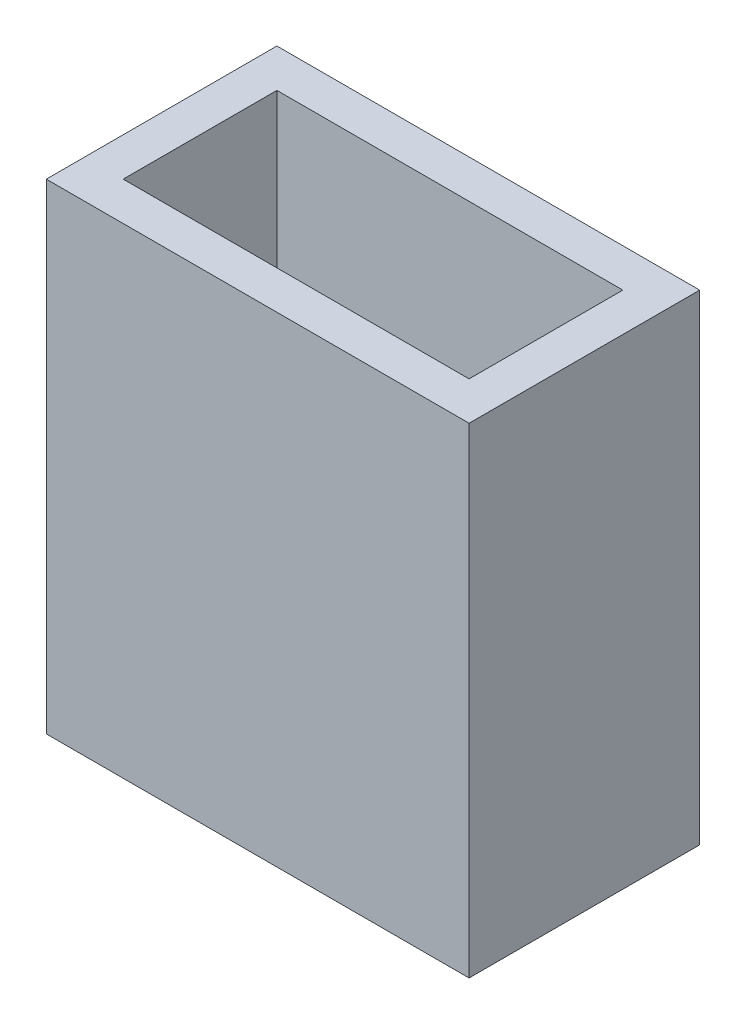
ISO-10303-21;
HEADER;
FILE_DESCRIPTION(('STEP AP214'),'2;1');
FILE_NAME('part.step','',(''),(''),'','','');
FILE_SCHEMA(('AUTOMOTIVE_DESIGN { 1 0 10303 214 1 1 1 1 }'));
ENDSEC;
DATA;
#1=APPLICATION_CONTEXT('core data for automotive mechanical design processes');
#2=APPLICATION_PROTOCOL_DEFINITION('international standard','automotive_design',2000,#1);
#3=PRODUCT_CONTEXT('',#1,'mechanical');
#4=PRODUCT('Part','Part','',(#3));
#5=PRODUCT_RELATED_PRODUCT_CATEGORY('part','',(#4));
#6=PRODUCT_DEFINITION_FORMATION('','',#4);
#7=PRODUCT_DEFINITION_CONTEXT('part definition',#1,'design');
#8=PRODUCT_DEFINITION('design','',#6,#7);
#9=PRODUCT_DEFINITION_SHAPE('','',#8);
#10=(LENGTH_UNIT() NAMED_UNIT(*) SI_UNIT(.MILLI.,.METRE.));
#11=(NAMED_UNIT(*) PLANE_ANGLE_UNIT() SI_UNIT($,.RADIAN.));
#12=(NAMED_UNIT(*) SI_UNIT($,.STERADIAN.) SOLID_ANGLE_UNIT());
#13=UNCERTAINTY_MEASURE_WITH_UNIT(LENGTH_MEASURE(1.E-05),#10,'distance_accuracy_value','');
#14=(GEOMETRIC_REPRESENTATION_CONTEXT(3) GLOBAL_UNCERTAINTY_ASSIGNED_CONTEXT((#13)) GLOBAL_UNIT_ASSIGNED_CONTEXT((#10,
#11,#12)) REPRESENTATION_CONTEXT('',''));
#15=CARTESIAN_POINT('',(0.,0.,0.));
#16=DIRECTION('',(0.,0.,1.));
#17=DIRECTION('',(1.,0.,0.));
#18=AXIS2_PLACEMENT_3D('',#15,#16,#17);
#19=CARTESIAN_POINT('',(0.,0.,12.));
#20=DIRECTION('',(1.,0.,0.));
#21=DIRECTION('',(0.,0.,-1.));
#22=AXIS2_PLACEMENT_3D('',#19,#20,#21);
#23=PLANE('',#22);
#24=DIRECTION('',(0.,-1.,0.));
#25=VECTOR('',#24,1.);
#26=CARTESIAN_POINT('',(0.,0.,0.));
#27=LINE('',#26,#25);
#28=CARTESIAN_POINT('',(0.,25.,0.));
#29=VERTEX_POINT('',#28);
#30=CARTESIAN_POINT('',(0.,0.,0.));
#31=VERTEX_POINT('',#30);
#32=EDGE_CURVE('E130',#29,#31,#27,.T.);
#33=ORIENTED_EDGE('',*,*,#32,.T.);
#34=DIRECTION('',(0.,0.,-1.));
#35=VECTOR('',#34,1.);
#36=CARTESIAN_POINT('',(0.,0.,12.));
#37=LINE('',#36,#35);
#38=CARTESIAN_POINT('',(0.,0.,12.));
#39=VERTEX_POINT('',#38);
#40=EDGE_CURVE('E11',#39,#31,#37,.T.);
#41=ORIENTED_EDGE('',*,*,#40,.F.);
#42=DIRECTION('',(0.,-1.,0.));
#43=VECTOR('',#42,1.);
#44=CARTESIAN_POINT('',(0.,0.,12.));
#45=LINE('',#44,#43);
#46=CARTESIAN_POINT('',(0.,25.,12.));
#47=VERTEX_POINT('',#46);
#48=EDGE_CURVE('E134',#47,#39,#45,.T.);
#49=ORIENTED_EDGE('',*,*,#48,.F.);
#50=DIRECTION('',(0.,0.,-1.));
#51=VECTOR('',#50,1.);
#52=CARTESIAN_POINT('',(0.,25.,12.));
#53=LINE('',#52,#51);
#54=EDGE_CURVE('E144',#47,#29,#53,.T.);
#55=ORIENTED_EDGE('',*,*,#54,.T.);
#56=EDGE_LOOP('',(#33,#41,#49,#55));
#57=FACE_BOUND('',#56,.T.);
#58=ADVANCED_FACE('F33',(#57),#23,.F.);
#59=CARTESIAN_POINT('',(0.,0.,12.));
#60=DIRECTION('',(0.,1.,0.));
#61=DIRECTION('',(0.,0.,1.));
#62=AXIS2_PLACEMENT_3D('',#59,#60,#61);
#63=PLANE('',#62);
#64=DIRECTION('',(-1.,0.,0.));
#65=VECTOR('',#64,1.);
#66=CARTESIAN_POINT('',(2.,0.,2.));
#67=LINE('',#66,#65);
#68=CARTESIAN_POINT('',(20.,0.,2.));
#69=VERTEX_POINT('',#68);
#70=CARTESIAN_POINT('',(2.,0.,2.));
#71=VERTEX_POINT('',#70);
#72=EDGE_CURVE('E105',#69,#71,#67,.T.);
#73=ORIENTED_EDGE('',*,*,#72,.T.);
#74=DIRECTION('',(0.,0.,1.));
#75=VECTOR('',#74,1.);
#76=CARTESIAN_POINT('',(2.,0.,2.));
#77=LINE('',#76,#75);
#78=CARTESIAN_POINT('',(2.,0.,10.));
#79=VERTEX_POINT('',#78);
#80=EDGE_CURVE('E99',#71,#79,#77,.T.);
#81=ORIENTED_EDGE('',*,*,#80,.T.);
#82=DIRECTION('',(1.,0.,0.));
#83=VECTOR('',#82,1.);
#84=CARTESIAN_POINT('',(2.,0.,10.));
#85=LINE('',#84,#83);
#86=CARTESIAN_POINT('',(20.,0.,10.));
#87=VERTEX_POINT('',#86);
#88=EDGE_CURVE('E108',#79,#87,#85,.T.);
#89=ORIENTED_EDGE('',*,*,#88,.T.);
#90=DIRECTION('',(0.,0.,-1.));
#91=VECTOR('',#90,1.);
#92=CARTESIAN_POINT('',(20.,0.,2.));
#93=LINE('',#92,#91);
#94=EDGE_CURVE('E47',#87,#69,#93,.T.);
#95=ORIENTED_EDGE('',*,*,#94,.T.);
#96=EDGE_LOOP('',(#73,#81,#89,#95));
#97=FACE_BOUND('',#96,.T.);
#98=DIRECTION('',(1.,0.,0.));
#99=VECTOR('',#98,1.);
#100=CARTESIAN_POINT('',(0.,0.,0.));
#101=LINE('',#100,#99);
#102=CARTESIAN_POINT('',(22.,0.,0.));
#103=VERTEX_POINT('',#102);
#104=EDGE_CURVE('E147',#31,#103,#101,.T.);
#105=ORIENTED_EDGE('',*,*,#104,.T.);
#106=DIRECTION('',(0.,0.,-1.));
#107=VECTOR('',#106,1.);
#108=CARTESIAN_POINT('',(22.,0.,12.));
#109=LINE('',#108,#107);
#110=CARTESIAN_POINT('',(22.,0.,12.));
#111=VERTEX_POINT('',#110);
#112=EDGE_CURVE('E40',#111,#103,#109,.T.);
#113=ORIENTED_EDGE('',*,*,#112,.F.);
#114=DIRECTION('',(1.,0.,0.));
#115=VECTOR('',#114,1.);
#116=CARTESIAN_POINT('',(0.,0.,12.));
#117=LINE('',#116,#115);
#118=EDGE_CURVE('E137',#39,#111,#117,.T.);
#119=ORIENTED_EDGE('',*,*,#118,.F.);
#120=ORIENTED_EDGE('',*,*,#40,.T.);
#121=EDGE_LOOP('',(#105,#113,#119,#120));
#122=FACE_BOUND('',#121,.T.);
#123=ADVANCED_FACE('F112',(#97,#122),#63,.F.);
#124=CARTESIAN_POINT('',(22.,0.,12.));
#125=DIRECTION('',(-1.,0.,0.));
#126=DIRECTION('',(0.,0.,1.));
#127=AXIS2_PLACEMENT_3D('',#124,#125,#126);
#128=PLANE('',#127);
#129=DIRECTION('',(0.,1.,0.));
#130=VECTOR('',#129,1.);
#131=CARTESIAN_POINT('',(22.,0.,0.));
#132=LINE('',#131,#130);
#133=CARTESIAN_POINT('',(22.,25.,0.));
#134=VERTEX_POINT('',#133);
#135=EDGE_CURVE('E149',#103,#134,#132,.T.);
#136=ORIENTED_EDGE('',*,*,#135,.T.);
#137=DIRECTION('',(0.,0.,-1.));
#138=VECTOR('',#137,1.);
#139=CARTESIAN_POINT('',(22.,25.,12.));
#140=LINE('',#139,#138);
#141=CARTESIAN_POINT('',(22.,25.,12.));
#142=VERTEX_POINT('',#141);
#143=EDGE_CURVE('E154',#142,#134,#140,.T.);
#144=ORIENTED_EDGE('',*,*,#143,.F.);
#145=DIRECTION('',(0.,1.,0.));
#146=VECTOR('',#145,1.);
#147=CARTESIAN_POINT('',(22.,0.,12.));
#148=LINE('',#147,#146);
#149=EDGE_CURVE('E140',#111,#142,#148,.T.);
#150=ORIENTED_EDGE('',*,*,#149,.F.);
#151=ORIENTED_EDGE('',*,*,#112,.T.);
#152=EDGE_LOOP('',(#136,#144,#150,#151));
#153=FACE_BOUND('',#152,.T.);
#154=ADVANCED_FACE('F161',(#153),#128,.F.);
#155=CARTESIAN_POINT('',(0.,25.,12.));
#156=DIRECTION('',(0.,-1.,0.));
#157=DIRECTION('',(0.,0.,-1.));
#158=AXIS2_PLACEMENT_3D('',#155,#156,#157);
#159=PLANE('',#158);
#160=DIRECTION('',(1.,0.,0.));
#161=VECTOR('',#160,1.);
#162=CARTESIAN_POINT('',(2.,25.,10.));
#163=LINE('',#162,#161);
#164=CARTESIAN_POINT('',(2.,25.,10.));
#165=VERTEX_POINT('',#164);
#166=CARTESIAN_POINT('',(20.,25.,10.));
#167=VERTEX_POINT('',#166);
#168=EDGE_CURVE('E124',#165,#167,#163,.T.);
#169=ORIENTED_EDGE('',*,*,#168,.F.);
#170=DIRECTION('',(0.,0.,1.));
#171=VECTOR('',#170,1.);
#172=CARTESIAN_POINT('',(2.,25.,2.));
#173=LINE('',#172,#171);
#174=CARTESIAN_POINT('',(2.,25.,2.));
#175=VERTEX_POINT('',#174);
#176=EDGE_CURVE('E55',#175,#165,#173,.T.);
#177=ORIENTED_EDGE('',*,*,#176,.F.);
#178=DIRECTION('',(-1.,0.,0.));
#179=VECTOR('',#178,1.);
#180=CARTESIAN_POINT('',(2.,25.,2.));
#181=LINE('',#180,#179);
#182=CARTESIAN_POINT('',(20.,25.,2.));
#183=VERTEX_POINT('',#182);
#184=EDGE_CURVE('E115',#183,#175,#181,.T.);
#185=ORIENTED_EDGE('',*,*,#184,.F.);
#186=DIRECTION('',(0.,0.,-1.));
#187=VECTOR('',#186,1.);
#188=CARTESIAN_POINT('',(20.,25.,2.));
#189=LINE('',#188,#187);
#190=EDGE_CURVE('E118',#167,#183,#189,.T.);
#191=ORIENTED_EDGE('',*,*,#190,.F.);
#192=EDGE_LOOP('',(#169,#177,#185,#191));
#193=FACE_BOUND('',#192,.T.);
#194=DIRECTION('',(-1.,0.,0.));
#195=VECTOR('',#194,1.);
#196=CARTESIAN_POINT('',(0.,25.,0.));
#197=LINE('',#196,#195);
#198=EDGE_CURVE('E138',#134,#29,#197,.T.);
#199=ORIENTED_EDGE('',*,*,#198,.T.);
#200=ORIENTED_EDGE('',*,*,#54,.F.);
#201=DIRECTION('',(-1.,0.,0.));
#202=VECTOR('',#201,1.);
#203=CARTESIAN_POINT('',(0.,25.,12.));
#204=LINE('',#203,#202);
#205=EDGE_CURVE('E142',#142,#47,#204,.T.);
#206=ORIENTED_EDGE('',*,*,#205,.F.);
#207=ORIENTED_EDGE('',*,*,#143,.T.);
#208=EDGE_LOOP('',(#199,#200,#206,#207));
#209=FACE_BOUND('',#208,.T.);
#210=ADVANCED_FACE('F169',(#193,#209),#159,.F.);
#211=CARTESIAN_POINT('',(0.,0.,12.));
#212=DIRECTION('',(0.,0.,-1.));
#213=DIRECTION('',(-1.,0.,0.));
#214=AXIS2_PLACEMENT_3D('',#211,#212,#213);
#215=PLANE('',#214);
#216=ORIENTED_EDGE('',*,*,#48,.T.);
#217=ORIENTED_EDGE('',*,*,#118,.T.);
#218=ORIENTED_EDGE('',*,*,#149,.T.);
#219=ORIENTED_EDGE('',*,*,#205,.T.);
#220=EDGE_LOOP('',(#216,#217,#218,#219));
#221=FACE_BOUND('',#220,.T.);
#222=ADVANCED_FACE('F175',(#221),#215,.F.);
#223=CARTESIAN_POINT('',(0.,0.,0.));
#224=DIRECTION('',(0.,0.,-1.));
#225=DIRECTION('',(-1.,0.,0.));
#226=AXIS2_PLACEMENT_3D('',#223,#224,#225);
#227=PLANE('',#226);
#228=ORIENTED_EDGE('',*,*,#32,.F.);
#229=ORIENTED_EDGE('',*,*,#198,.F.);
#230=ORIENTED_EDGE('',*,*,#135,.F.);
#231=ORIENTED_EDGE('',*,*,#104,.F.);
#232=EDGE_LOOP('',(#228,#229,#230,#231));
#233=FACE_BOUND('',#232,.T.);
#234=ADVANCED_FACE('F166',(#233),#227,.T.);
#235=CARTESIAN_POINT('',(2.,0.,2.));
#236=DIRECTION('',(-1.,0.,0.));
#237=DIRECTION('',(0.,0.,1.));
#238=AXIS2_PLACEMENT_3D('',#235,#236,#237);
#239=PLANE('',#238);
#240=ORIENTED_EDGE('',*,*,#176,.T.);
#241=DIRECTION('',(0.,1.,0.));
#242=VECTOR('',#241,1.);
#243=CARTESIAN_POINT('',(2.,0.,10.));
#244=LINE('',#243,#242);
#245=EDGE_CURVE('E95',#79,#165,#244,.T.);
#246=ORIENTED_EDGE('',*,*,#245,.F.);
#247=ORIENTED_EDGE('',*,*,#80,.F.);
#248=DIRECTION('',(0.,1.,0.));
#249=VECTOR('',#248,1.);
#250=CARTESIAN_POINT('',(2.,0.,2.));
#251=LINE('',#250,#249);
#252=EDGE_CURVE('E128',#71,#175,#251,.T.);
#253=ORIENTED_EDGE('',*,*,#252,.T.);
#254=EDGE_LOOP('',(#240,#246,#247,#253));
#255=FACE_BOUND('',#254,.T.);
#256=ADVANCED_FACE('F97',(#255),#239,.F.);
#257=CARTESIAN_POINT('',(2.,0.,2.));
#258=DIRECTION('',(0.,0.,-1.));
#259=DIRECTION('',(-1.,0.,0.));
#260=AXIS2_PLACEMENT_3D('',#257,#258,#259);
#261=PLANE('',#260);
#262=ORIENTED_EDGE('',*,*,#184,.T.);
#263=ORIENTED_EDGE('',*,*,#252,.F.);
#264=ORIENTED_EDGE('',*,*,#72,.F.);
#265=DIRECTION('',(0.,1.,0.));
#266=VECTOR('',#265,1.);
#267=CARTESIAN_POINT('',(20.,0.,2.));
#268=LINE('',#267,#266);
#269=EDGE_CURVE('E131',#69,#183,#268,.T.);
#270=ORIENTED_EDGE('',*,*,#269,.T.);
#271=EDGE_LOOP('',(#262,#263,#264,#270));
#272=FACE_BOUND('',#271,.T.);
#273=ADVANCED_FACE('F192',(#272),#261,.F.);
#274=CARTESIAN_POINT('',(20.,0.,2.));
#275=DIRECTION('',(1.,0.,0.));
#276=DIRECTION('',(0.,0.,-1.));
#277=AXIS2_PLACEMENT_3D('',#274,#275,#276);
#278=PLANE('',#277);
#279=ORIENTED_EDGE('',*,*,#190,.T.);
#280=ORIENTED_EDGE('',*,*,#269,.F.);
#281=ORIENTED_EDGE('',*,*,#94,.F.);
#282=DIRECTION('',(0.,1.,0.));
#283=VECTOR('',#282,1.);
#284=CARTESIAN_POINT('',(20.,0.,10.));
#285=LINE('',#284,#283);
#286=EDGE_CURVE('E104',#87,#167,#285,.T.);
#287=ORIENTED_EDGE('',*,*,#286,.T.);
#288=EDGE_LOOP('',(#279,#280,#281,#287));
#289=FACE_BOUND('',#288,.T.);
#290=ADVANCED_FACE('F195',(#289),#278,.F.);
#291=CARTESIAN_POINT('',(2.,0.,10.));
#292=DIRECTION('',(0.,0.,1.));
#293=DIRECTION('',(1.,0.,0.));
#294=AXIS2_PLACEMENT_3D('',#291,#292,#293);
#295=PLANE('',#294);
#296=ORIENTED_EDGE('',*,*,#168,.T.);
#297=ORIENTED_EDGE('',*,*,#286,.F.);
#298=ORIENTED_EDGE('',*,*,#88,.F.);
#299=ORIENTED_EDGE('',*,*,#245,.T.);
#300=EDGE_LOOP('',(#296,#297,#298,#299));
#301=FACE_BOUND('',#300,.T.);
#302=ADVANCED_FACE('F109',(#301),#295,.F.);
#303=CLOSED_SHELL('',(#58,#123,#154,#210,#222,#234,#256,#273,#290,#302));
#304=MANIFOLD_SOLID_BREP('B2',#303);
#305=ADVANCED_BREP_SHAPE_REPRESENTATION('',(#18,#304),#14);
#306=SHAPE_DEFINITION_REPRESENTATION(#9,#305);
ENDSEC;
END-ISO-10303-21;
